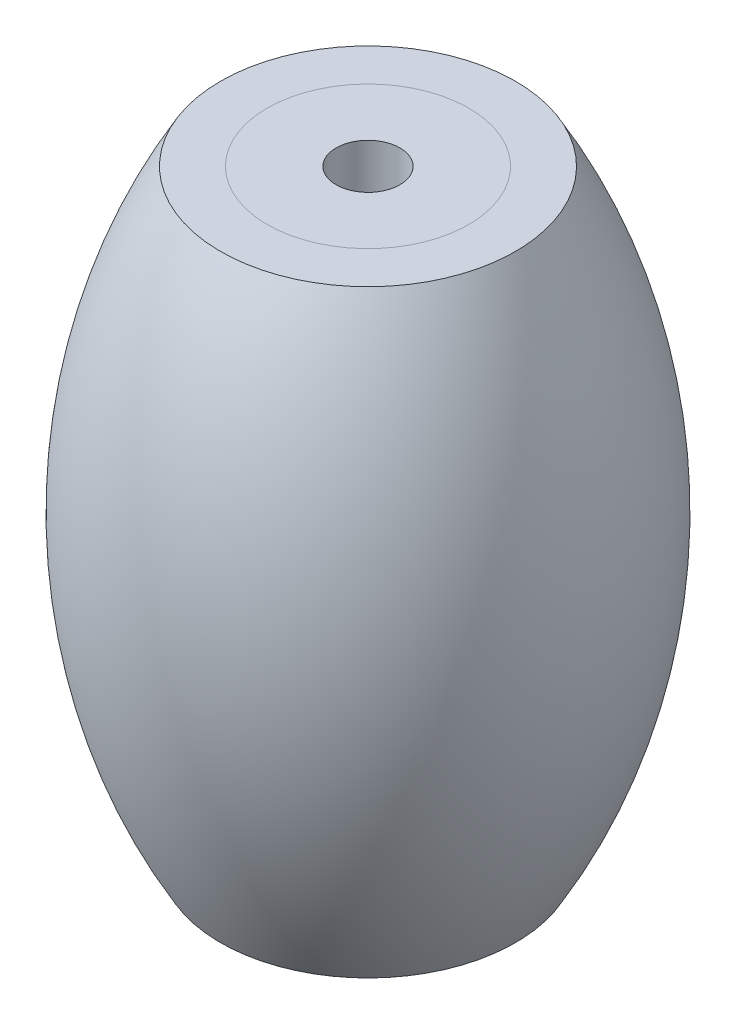
ISO-10303-21;
HEADER;
FILE_DESCRIPTION(('STEP AP214'),'2;1');
FILE_NAME('part.step','',(''),(''),'','','');
FILE_SCHEMA(('AUTOMOTIVE_DESIGN { 1 0 10303 214 1 1 1 1 }'));
ENDSEC;
DATA;
#1=APPLICATION_CONTEXT('core data for automotive mechanical design processes');
#2=APPLICATION_PROTOCOL_DEFINITION('international standard','automotive_design',2000,#1);
#3=PRODUCT_CONTEXT('',#1,'mechanical');
#4=PRODUCT('Part','Part','',(#3));
#5=PRODUCT_RELATED_PRODUCT_CATEGORY('part','',(#4));
#6=PRODUCT_DEFINITION_FORMATION('','',#4);
#7=PRODUCT_DEFINITION_CONTEXT('part definition',#1,'design');
#8=PRODUCT_DEFINITION('design','',#6,#7);
#9=PRODUCT_DEFINITION_SHAPE('','',#8);
#10=(LENGTH_UNIT() NAMED_UNIT(*) SI_UNIT(.MILLI.,.METRE.));
#11=(NAMED_UNIT(*) PLANE_ANGLE_UNIT() SI_UNIT($,.RADIAN.));
#12=(NAMED_UNIT(*) SI_UNIT($,.STERADIAN.) SOLID_ANGLE_UNIT());
#13=UNCERTAINTY_MEASURE_WITH_UNIT(LENGTH_MEASURE(1.E-05),#10,'distance_accuracy_value','');
#14=(GEOMETRIC_REPRESENTATION_CONTEXT(3) GLOBAL_UNCERTAINTY_ASSIGNED_CONTEXT((#13)) GLOBAL_UNIT_ASSIGNED_CONTEXT((#10,
#11,#12)) REPRESENTATION_CONTEXT('',''));
#15=CARTESIAN_POINT('',(0.,0.,0.));
#16=DIRECTION('',(0.,0.,1.));
#17=DIRECTION('',(1.,0.,0.));
#18=AXIS2_PLACEMENT_3D('',#15,#16,#17);
#19=CARTESIAN_POINT('',(0.,-7.50000000000001,0.));
#20=DIRECTION('',(0.,1.,0.));
#21=DIRECTION('',(-1.,0.,0.));
#22=AXIS2_PLACEMENT_3D('',#19,#20,#21);
#23=PLANE('',#22);
#24=CARTESIAN_POINT('',(0.,-7.50000000000001,0.));
#25=DIRECTION('',(0.,1.,0.));
#26=DIRECTION('',(-1.,0.,0.));
#27=AXIS2_PLACEMENT_3D('',#24,#25,#26);
#28=CIRCLE('',#27,3.695);
#29=CARTESIAN_POINT('',(-3.695,-7.50000000000001,0.));
#30=VERTEX_POINT('',#29);
#31=EDGE_CURVE('E57',#30,#30,#28,.T.);
#32=ORIENTED_EDGE('',*,*,#31,.F.);
#33=EDGE_LOOP('',(#32));
#34=FACE_BOUND('',#33,.T.);
#35=CARTESIAN_POINT('',(0.,-7.50000000000001,0.));
#36=DIRECTION('',(0.,1.,0.));
#37=DIRECTION('',(-1.,0.,0.));
#38=AXIS2_PLACEMENT_3D('',#35,#36,#37);
#39=CIRCLE('',#38,2.52620936077031);
#40=CARTESIAN_POINT('',(-2.52620936077031,-7.50000000000001,0.));
#41=VERTEX_POINT('',#40);
#42=EDGE_CURVE('E11',#41,#41,#39,.T.);
#43=ORIENTED_EDGE('',*,*,#42,.T.);
#44=EDGE_LOOP('',(#43));
#45=FACE_BOUND('',#44,.T.);
#46=ADVANCED_FACE('F43',(#34,#45),#23,.F.);
#47=CARTESIAN_POINT('',(0.,0.,0.));
#48=DIRECTION('',(0.,1.,0.));
#49=DIRECTION('',(-1.,0.,0.));
#50=AXIS2_PLACEMENT_3D('',#47,#48,#49);
#51=DEGENERATE_TOROIDAL_SURFACE('',#50,9.29538105676657,14.,.F.);
#52=CARTESIAN_POINT('',(0.,7.50000000000001,0.));
#53=DIRECTION('',(0.,1.,0.));
#54=DIRECTION('',(-1.,0.,0.));
#55=AXIS2_PLACEMENT_3D('',#52,#53,#54);
#56=CIRCLE('',#55,2.52620936077031);
#57=CARTESIAN_POINT('',(-2.52620936077031,7.50000000000001,0.));
#58=VERTEX_POINT('',#57);
#59=EDGE_CURVE('E49',#58,#58,#56,.T.);
#60=ORIENTED_EDGE('',*,*,#59,.T.);
#61=EDGE_LOOP('',(#60));
#62=FACE_BOUND('',#61,.T.);
#63=ORIENTED_EDGE('',*,*,#42,.F.);
#64=EDGE_LOOP('',(#63));
#65=FACE_BOUND('',#64,.T.);
#66=ADVANCED_FACE('F67',(#62,#65),#51,.T.);
#67=CARTESIAN_POINT('',(0.,7.50000000000001,0.));
#68=DIRECTION('',(0.,1.,0.));
#69=DIRECTION('',(-1.,0.,0.));
#70=AXIS2_PLACEMENT_3D('',#67,#68,#69);
#71=PLANE('',#70);
#72=CARTESIAN_POINT('',(0.,7.50000000000001,0.));
#73=DIRECTION('',(0.,1.,0.));
#74=DIRECTION('',(-1.,0.,0.));
#75=AXIS2_PLACEMENT_3D('',#72,#73,#74);
#76=CIRCLE('',#75,3.695);
#77=CARTESIAN_POINT('',(-3.695,7.50000000000001,0.));
#78=VERTEX_POINT('',#77);
#79=EDGE_CURVE('E53',#78,#78,#76,.T.);
#80=ORIENTED_EDGE('',*,*,#79,.T.);
#81=EDGE_LOOP('',(#80));
#82=FACE_BOUND('',#81,.T.);
#83=ORIENTED_EDGE('',*,*,#59,.F.);
#84=EDGE_LOOP('',(#83));
#85=FACE_BOUND('',#84,.T.);
#86=ADVANCED_FACE('F71',(#82,#85),#71,.T.);
#87=CARTESIAN_POINT('',(0.,0.,0.));
#88=DIRECTION('',(0.,1.,0.));
#89=DIRECTION('',(-1.,0.,0.));
#90=AXIS2_PLACEMENT_3D('',#87,#88,#89);
#91=DEGENERATE_TOROIDAL_SURFACE('',#90,9.29538105676657,15.,.F.);
#92=ORIENTED_EDGE('',*,*,#31,.T.);
#93=EDGE_LOOP('',(#92));
#94=FACE_BOUND('',#93,.T.);
#95=ORIENTED_EDGE('',*,*,#79,.F.);
#96=EDGE_LOOP('',(#95));
#97=FACE_BOUND('',#96,.T.);
#98=ADVANCED_FACE('F63',(#94,#97),#91,.F.);
#99=CLOSED_SHELL('',(#46,#66,#86,#98));
#100=MANIFOLD_SOLID_BREP('B2',#99);
#101=CARTESIAN_POINT('',(0.,0.,0.));
#102=DIRECTION('',(0.,1.,0.));
#103=DIRECTION('',(-1.,0.,0.));
#104=AXIS2_PLACEMENT_3D('',#101,#102,#103);
#105=DEGENERATE_TOROIDAL_SURFACE('',#104,9.29538105676657,14.,.F.);
#106=CARTESIAN_POINT('',(0.,7.50000000000001,0.));
#107=DIRECTION('',(0.,1.,0.));
#108=DIRECTION('',(-1.,0.,0.));
#109=AXIS2_PLACEMENT_3D('',#106,#107,#108);
#110=CIRCLE('',#109,2.52620936077031);
#111=CARTESIAN_POINT('',(-2.52620936077031,7.50000000000001,0.));
#112=VERTEX_POINT('',#111);
#113=EDGE_CURVE('E119',#112,#112,#110,.T.);
#114=ORIENTED_EDGE('',*,*,#113,.F.);
#115=EDGE_LOOP('',(#114));
#116=FACE_BOUND('',#115,.T.);
#117=CARTESIAN_POINT('',(0.,-7.50000000000001,0.));
#118=DIRECTION('',(0.,1.,0.));
#119=DIRECTION('',(-1.,0.,0.));
#120=AXIS2_PLACEMENT_3D('',#117,#118,#119);
#121=CIRCLE('',#120,2.52620936077031);
#122=CARTESIAN_POINT('',(-2.52620936077031,-7.50000000000001,0.));
#123=VERTEX_POINT('',#122);
#124=EDGE_CURVE('E42',#123,#123,#121,.T.);
#125=ORIENTED_EDGE('',*,*,#124,.T.);
#126=EDGE_LOOP('',(#125));
#127=FACE_BOUND('',#126,.T.);
#128=ADVANCED_FACE('F105',(#116,#127),#105,.F.);
#129=CARTESIAN_POINT('',(0.,-7.50000000000001,0.));
#130=DIRECTION('',(0.,1.,0.));
#131=DIRECTION('',(-1.,0.,0.));
#132=AXIS2_PLACEMENT_3D('',#129,#130,#131);
#133=PLANE('',#132);
#134=ORIENTED_EDGE('',*,*,#124,.F.);
#135=EDGE_LOOP('',(#134));
#136=FACE_BOUND('',#135,.T.);
#137=CARTESIAN_POINT('',(0.,-7.50000000000001,0.));
#138=DIRECTION('',(0.,1.,0.));
#139=DIRECTION('',(-1.,0.,0.));
#140=AXIS2_PLACEMENT_3D('',#137,#138,#139);
#141=CIRCLE('',#140,0.8);
#142=CARTESIAN_POINT('',(-0.799999999999997,-7.50000000000001,0.));
#143=VERTEX_POINT('',#142);
#144=EDGE_CURVE('E111',#143,#143,#141,.T.);
#145=ORIENTED_EDGE('',*,*,#144,.T.);
#146=EDGE_LOOP('',(#145));
#147=FACE_BOUND('',#146,.T.);
#148=ADVANCED_FACE('F129',(#136,#147),#133,.F.);
#149=CARTESIAN_POINT('',(0.,7.50000000000001,0.));
#150=DIRECTION('',(0.,1.,0.));
#151=DIRECTION('',(-1.,0.,0.));
#152=AXIS2_PLACEMENT_3D('',#149,#150,#151);
#153=CYLINDRICAL_SURFACE('',#152,0.8);
#154=ORIENTED_EDGE('',*,*,#144,.F.);
#155=EDGE_LOOP('',(#154));
#156=FACE_BOUND('',#155,.T.);
#157=CARTESIAN_POINT('',(0.,7.50000000000001,0.));
#158=DIRECTION('',(0.,1.,0.));
#159=DIRECTION('',(-1.,0.,0.));
#160=AXIS2_PLACEMENT_3D('',#157,#158,#159);
#161=CIRCLE('',#160,0.800000000000001);
#162=CARTESIAN_POINT('',(-0.799999999999997,7.50000000000001,0.));
#163=VERTEX_POINT('',#162);
#164=EDGE_CURVE('E115',#163,#163,#161,.T.);
#165=ORIENTED_EDGE('',*,*,#164,.T.);
#166=EDGE_LOOP('',(#165));
#167=FACE_BOUND('',#166,.T.);
#168=ADVANCED_FACE('F133',(#156,#167),#153,.F.);
#169=CARTESIAN_POINT('',(0.,7.50000000000001,0.));
#170=DIRECTION('',(0.,1.,0.));
#171=DIRECTION('',(-1.,0.,0.));
#172=AXIS2_PLACEMENT_3D('',#169,#170,#171);
#173=PLANE('',#172);
#174=ORIENTED_EDGE('',*,*,#113,.T.);
#175=EDGE_LOOP('',(#174));
#176=FACE_BOUND('',#175,.T.);
#177=ORIENTED_EDGE('',*,*,#164,.F.);
#178=EDGE_LOOP('',(#177));
#179=FACE_BOUND('',#178,.T.);
#180=ADVANCED_FACE('F125',(#176,#179),#173,.T.);
#181=CLOSED_SHELL('',(#128,#148,#168,#180));
#182=MANIFOLD_SOLID_BREP('B6',#181);
#183=ADVANCED_BREP_SHAPE_REPRESENTATION('',(#18,#100,#182),#14);
#184=SHAPE_DEFINITION_REPRESENTATION(#9,#183);
ENDSEC;
END-ISO-10303-21;
